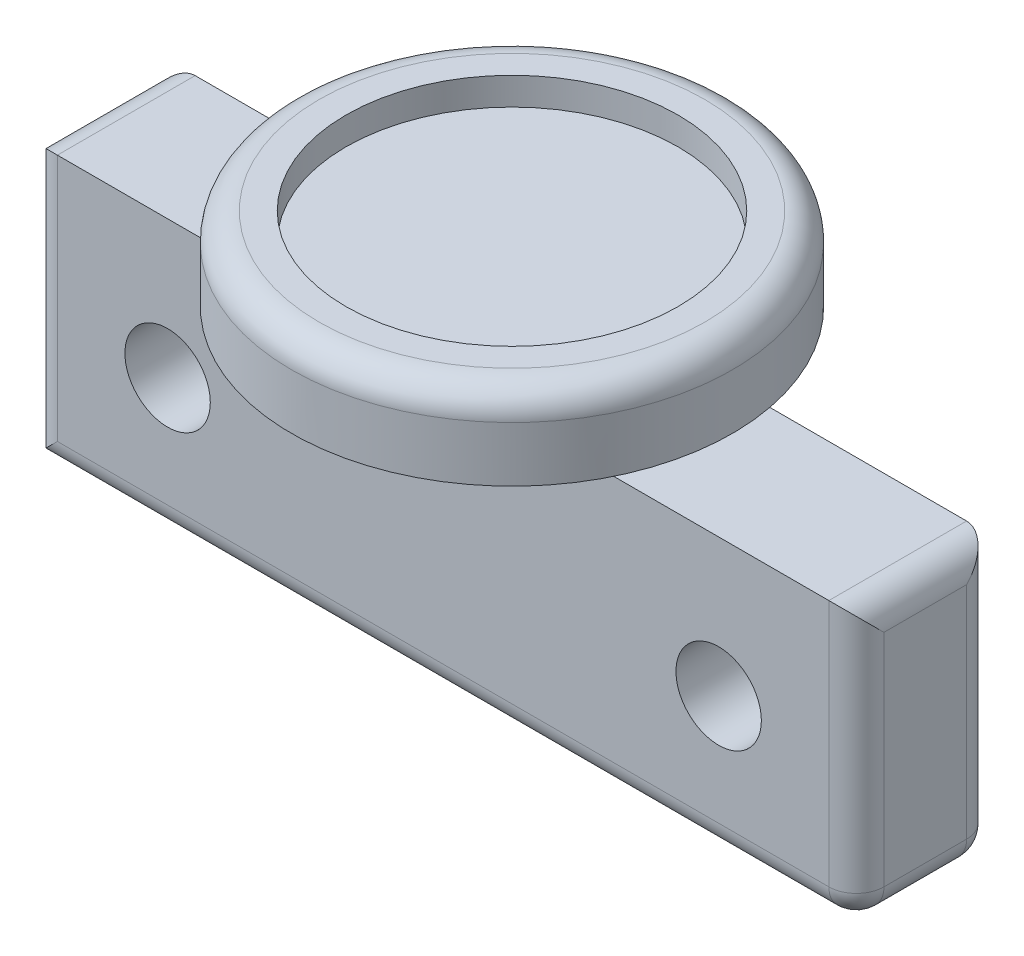
ISO-10303-21;
HEADER;
FILE_DESCRIPTION(('STEP AP214'),'2;1');
FILE_NAME('part.step','',(''),(''),'','','');
FILE_SCHEMA(('AUTOMOTIVE_DESIGN { 1 0 10303 214 1 1 1 1 }'));
ENDSEC;
DATA;
#1=APPLICATION_CONTEXT('core data for automotive mechanical design processes');
#2=APPLICATION_PROTOCOL_DEFINITION('international standard','automotive_design',2000,#1);
#3=PRODUCT_CONTEXT('',#1,'mechanical');
#4=PRODUCT('Part','Part','',(#3));
#5=PRODUCT_RELATED_PRODUCT_CATEGORY('part','',(#4));
#6=PRODUCT_DEFINITION_FORMATION('','',#4);
#7=PRODUCT_DEFINITION_CONTEXT('part definition',#1,'design');
#8=PRODUCT_DEFINITION('design','',#6,#7);
#9=PRODUCT_DEFINITION_SHAPE('','',#8);
#10=(LENGTH_UNIT() NAMED_UNIT(*) SI_UNIT(.MILLI.,.METRE.));
#11=(NAMED_UNIT(*) PLANE_ANGLE_UNIT() SI_UNIT($,.RADIAN.));
#12=(NAMED_UNIT(*) SI_UNIT($,.STERADIAN.) SOLID_ANGLE_UNIT());
#13=UNCERTAINTY_MEASURE_WITH_UNIT(LENGTH_MEASURE(1.E-05),#10,'distance_accuracy_value','');
#14=(GEOMETRIC_REPRESENTATION_CONTEXT(3) GLOBAL_UNCERTAINTY_ASSIGNED_CONTEXT((#13)) GLOBAL_UNIT_ASSIGNED_CONTEXT((#10,
#11,#12)) REPRESENTATION_CONTEXT('',''));
#15=CARTESIAN_POINT('',(0.,0.,0.));
#16=DIRECTION('',(0.,0.,1.));
#17=DIRECTION('',(1.,0.,0.));
#18=AXIS2_PLACEMENT_3D('',#15,#16,#17);
#19=CARTESIAN_POINT('',(-38.1,12.7,6.35));
#20=DIRECTION('',(0.,-1.,0.));
#21=DIRECTION('',(0.,0.,-1.));
#22=AXIS2_PLACEMENT_3D('',#19,#20,#21);
#23=PLANE('',#22);
#24=DIRECTION('',(-1.,0.,0.));
#25=VECTOR('',#24,1.);
#26=CARTESIAN_POINT('',(-38.1,12.7,6.35));
#27=LINE('',#26,#25);
#28=CARTESIAN_POINT('',(35.56,12.7,6.35));
#29=VERTEX_POINT('',#28);
#30=CARTESIAN_POINT('',(10.9985226280624,12.7,6.35));
#31=VERTEX_POINT('',#30);
#32=EDGE_CURVE('E127',#29,#31,#27,.T.);
#33=ORIENTED_EDGE('',*,*,#32,.F.);
#34=DIRECTION('',(0.,0.,-1.));
#35=VECTOR('',#34,1.);
#36=CARTESIAN_POINT('',(35.56,12.7,6.35));
#37=LINE('',#36,#35);
#38=CARTESIAN_POINT('',(35.56,12.7,-6.35));
#39=VERTEX_POINT('',#38);
#40=EDGE_CURVE('E256',#29,#39,#37,.T.);
#41=ORIENTED_EDGE('',*,*,#40,.T.);
#42=DIRECTION('',(-1.,0.,0.));
#43=VECTOR('',#42,1.);
#44=CARTESIAN_POINT('',(-38.1,12.7,-6.35));
#45=LINE('',#44,#43);
#46=CARTESIAN_POINT('',(10.9985226280624,12.7,-6.35));
#47=VERTEX_POINT('',#46);
#48=EDGE_CURVE('E143',#39,#47,#45,.T.);
#49=ORIENTED_EDGE('',*,*,#48,.T.);
#50=CARTESIAN_POINT('',(0.,12.7,0.));
#51=DIRECTION('',(0.,1.,0.));
#52=DIRECTION('',(0.,0.,1.));
#53=AXIS2_PLACEMENT_3D('',#50,#51,#52);
#54=CIRCLE('',#53,12.7);
#55=EDGE_CURVE('E152',#31,#47,#54,.T.);
#56=ORIENTED_EDGE('',*,*,#55,.F.);
#57=EDGE_LOOP('',(#33,#41,#49,#56));
#58=FACE_BOUND('',#57,.T.);
#59=ADVANCED_FACE('F39',(#58),#23,.F.);
#60=CARTESIAN_POINT('',(38.1,12.7,6.35));
#61=DIRECTION('',(-1.,0.,0.));
#62=DIRECTION('',(0.,-1.,0.));
#63=AXIS2_PLACEMENT_3D('',#60,#61,#62);
#64=PLANE('',#63);
#65=DIRECTION('',(0.,1.,0.));
#66=VECTOR('',#65,1.);
#67=CARTESIAN_POINT('',(38.1,-12.7,3.81));
#68=LINE('',#67,#66);
#69=CARTESIAN_POINT('',(38.1,10.16,3.81));
#70=VERTEX_POINT('',#69);
#71=CARTESIAN_POINT('',(38.1,-10.16,3.81));
#72=VERTEX_POINT('',#71);
#73=EDGE_CURVE('E347',#70,#72,#68,.F.);
#74=ORIENTED_EDGE('',*,*,#73,.T.);
#75=DIRECTION('',(0.,0.,-1.));
#76=VECTOR('',#75,1.);
#77=CARTESIAN_POINT('',(38.1,-10.16,6.35));
#78=LINE('',#77,#76);
#79=CARTESIAN_POINT('',(38.1,-10.16,-3.81));
#80=VERTEX_POINT('',#79);
#81=EDGE_CURVE('E358',#72,#80,#78,.T.);
#82=ORIENTED_EDGE('',*,*,#81,.T.);
#83=DIRECTION('',(0.,1.,0.));
#84=VECTOR('',#83,1.);
#85=CARTESIAN_POINT('',(38.1,12.7,-3.81));
#86=LINE('',#85,#84);
#87=CARTESIAN_POINT('',(38.1,10.16,-3.81));
#88=VERTEX_POINT('',#87);
#89=EDGE_CURVE('E355',#80,#88,#86,.T.);
#90=ORIENTED_EDGE('',*,*,#89,.T.);
#91=DIRECTION('',(0.,0.,-1.));
#92=VECTOR('',#91,1.);
#93=CARTESIAN_POINT('',(38.1,10.16,6.35));
#94=LINE('',#93,#92);
#95=EDGE_CURVE('E350',#88,#70,#94,.F.);
#96=ORIENTED_EDGE('',*,*,#95,.T.);
#97=EDGE_LOOP('',(#74,#82,#90,#96));
#98=FACE_BOUND('',#97,.T.);
#99=ADVANCED_FACE('F276',(#98),#64,.F.);
#100=CARTESIAN_POINT('',(-10.9985226280624,12.7,-6.35));
#101=VERTEX_POINT('',#100);
#102=CARTESIAN_POINT('',(-35.56,12.7,-6.35));
#103=VERTEX_POINT('',#102);
#104=EDGE_CURVE('E243',#101,#103,#45,.T.);
#105=ORIENTED_EDGE('',*,*,#104,.T.);
#106=DIRECTION('',(0.,0.,-1.));
#107=VECTOR('',#106,1.);
#108=CARTESIAN_POINT('',(-35.56,12.7,6.35));
#109=LINE('',#108,#107);
#110=CARTESIAN_POINT('',(-35.56,12.7,6.35));
#111=VERTEX_POINT('',#110);
#112=EDGE_CURVE('E141',#103,#111,#109,.F.);
#113=ORIENTED_EDGE('',*,*,#112,.T.);
#114=CARTESIAN_POINT('',(-10.9985226280624,12.7,6.35));
#115=VERTEX_POINT('',#114);
#116=EDGE_CURVE('E124',#115,#111,#27,.T.);
#117=ORIENTED_EDGE('',*,*,#116,.F.);
#118=EDGE_CURVE('E138',#101,#115,#54,.T.);
#119=ORIENTED_EDGE('',*,*,#118,.F.);
#120=EDGE_LOOP('',(#105,#113,#117,#119));
#121=FACE_BOUND('',#120,.T.);
#122=ADVANCED_FACE('F136',(#121),#23,.F.);
#123=CARTESIAN_POINT('',(-38.1,12.7,6.35));
#124=DIRECTION('',(1.,0.,0.));
#125=DIRECTION('',(0.,0.,-1.));
#126=AXIS2_PLACEMENT_3D('',#123,#124,#125);
#127=PLANE('',#126);
#128=DIRECTION('',(0.,0.,-1.));
#129=VECTOR('',#128,1.);
#130=CARTESIAN_POINT('',(-38.1,10.16,6.35));
#131=LINE('',#130,#129);
#132=CARTESIAN_POINT('',(-38.1,10.16,3.81));
#133=VERTEX_POINT('',#132);
#134=CARTESIAN_POINT('',(-38.1,10.16,-3.81));
#135=VERTEX_POINT('',#134);
#136=EDGE_CURVE('E387',#133,#135,#131,.T.);
#137=ORIENTED_EDGE('',*,*,#136,.T.);
#138=DIRECTION('',(0.,-1.,0.));
#139=VECTOR('',#138,1.);
#140=CARTESIAN_POINT('',(-38.1,12.7,-3.81));
#141=LINE('',#140,#139);
#142=CARTESIAN_POINT('',(-38.1,-12.7,-3.81));
#143=VERTEX_POINT('',#142);
#144=EDGE_CURVE('E390',#135,#143,#141,.T.);
#145=ORIENTED_EDGE('',*,*,#144,.T.);
#146=DIRECTION('',(0.,0.,-1.));
#147=VECTOR('',#146,1.);
#148=CARTESIAN_POINT('',(-38.1,-12.7,6.35));
#149=LINE('',#148,#147);
#150=CARTESIAN_POINT('',(-38.1,-12.7,3.81));
#151=VERTEX_POINT('',#150);
#152=EDGE_CURVE('E158',#151,#143,#149,.T.);
#153=ORIENTED_EDGE('',*,*,#152,.F.);
#154=DIRECTION('',(0.,-1.,0.));
#155=VECTOR('',#154,1.);
#156=CARTESIAN_POINT('',(-38.1,12.7,3.81));
#157=LINE('',#156,#155);
#158=EDGE_CURVE('E384',#151,#133,#157,.F.);
#159=ORIENTED_EDGE('',*,*,#158,.T.);
#160=EDGE_LOOP('',(#137,#145,#153,#159));
#161=FACE_BOUND('',#160,.T.);
#162=ADVANCED_FACE('F285',(#161),#127,.F.);
#163=CARTESIAN_POINT('',(-38.1,-12.7,6.35));
#164=DIRECTION('',(0.,1.,0.));
#165=DIRECTION('',(0.,0.,1.));
#166=AXIS2_PLACEMENT_3D('',#163,#164,#165);
#167=PLANE('',#166);
#168=ORIENTED_EDGE('',*,*,#152,.T.);
#169=DIRECTION('',(1.,0.,0.));
#170=VECTOR('',#169,1.);
#171=CARTESIAN_POINT('',(-38.1,-12.7,-3.81));
#172=LINE('',#171,#170);
#173=CARTESIAN_POINT('',(35.56,-12.7,-3.81));
#174=VERTEX_POINT('',#173);
#175=EDGE_CURVE('E369',#143,#174,#172,.T.);
#176=ORIENTED_EDGE('',*,*,#175,.T.);
#177=DIRECTION('',(0.,0.,-1.));
#178=VECTOR('',#177,1.);
#179=CARTESIAN_POINT('',(35.56,-12.7,6.35));
#180=LINE('',#179,#178);
#181=CARTESIAN_POINT('',(35.56,-12.7,3.81));
#182=VERTEX_POINT('',#181);
#183=EDGE_CURVE('E365',#174,#182,#180,.F.);
#184=ORIENTED_EDGE('',*,*,#183,.T.);
#185=DIRECTION('',(1.,0.,0.));
#186=VECTOR('',#185,1.);
#187=CARTESIAN_POINT('',(-38.1,-12.7,3.81));
#188=LINE('',#187,#186);
#189=EDGE_CURVE('E362',#182,#151,#188,.F.);
#190=ORIENTED_EDGE('',*,*,#189,.T.);
#191=EDGE_LOOP('',(#168,#176,#184,#190));
#192=FACE_BOUND('',#191,.T.);
#193=ADVANCED_FACE('F289',(#192),#167,.F.);
#194=CARTESIAN_POINT('',(0.,0.,6.35));
#195=DIRECTION('',(0.,0.,1.));
#196=DIRECTION('',(1.,0.,0.));
#197=AXIS2_PLACEMENT_3D('',#194,#195,#196);
#198=PLANE('',#197);
#199=CARTESIAN_POINT('',(25.4,0.,6.35));
#200=DIRECTION('',(0.,0.,1.));
#201=DIRECTION('',(1.,0.,0.));
#202=AXIS2_PLACEMENT_3D('',#199,#200,#201);
#203=CIRCLE('',#202,3.937);
#204=CARTESIAN_POINT('',(29.337,0.,6.35));
#205=VERTEX_POINT('',#204);
#206=EDGE_CURVE('E237',#205,#205,#203,.T.);
#207=ORIENTED_EDGE('',*,*,#206,.F.);
#208=EDGE_LOOP('',(#207));
#209=FACE_BOUND('',#208,.T.);
#210=CARTESIAN_POINT('',(-25.4,0.,6.35));
#211=DIRECTION('',(0.,0.,1.));
#212=DIRECTION('',(1.,0.,0.));
#213=AXIS2_PLACEMENT_3D('',#210,#211,#212);
#214=CIRCLE('',#213,3.937);
#215=CARTESIAN_POINT('',(-21.463,0.,6.35));
#216=VERTEX_POINT('',#215);
#217=EDGE_CURVE('E231',#216,#216,#214,.T.);
#218=ORIENTED_EDGE('',*,*,#217,.F.);
#219=EDGE_LOOP('',(#218));
#220=FACE_BOUND('',#219,.T.);
#221=ORIENTED_EDGE('',*,*,#116,.T.);
#222=DIRECTION('',(0.,-1.,0.));
#223=VECTOR('',#222,1.);
#224=CARTESIAN_POINT('',(-35.56,-12.7,6.35));
#225=LINE('',#224,#223);
#226=CARTESIAN_POINT('',(-35.56,-10.16,6.35));
#227=VERTEX_POINT('',#226);
#228=EDGE_CURVE('E11',#111,#227,#225,.T.);
#229=ORIENTED_EDGE('',*,*,#228,.T.);
#230=DIRECTION('',(1.,0.,0.));
#231=VECTOR('',#230,1.);
#232=CARTESIAN_POINT('',(38.1,-10.16,6.35));
#233=LINE('',#232,#231);
#234=CARTESIAN_POINT('',(35.56,-10.16,6.35));
#235=VERTEX_POINT('',#234);
#236=EDGE_CURVE('E56',#227,#235,#233,.T.);
#237=ORIENTED_EDGE('',*,*,#236,.T.);
#238=DIRECTION('',(0.,1.,0.));
#239=VECTOR('',#238,1.);
#240=CARTESIAN_POINT('',(35.56,12.7,6.35));
#241=LINE('',#240,#239);
#242=EDGE_CURVE('E49',#235,#29,#241,.T.);
#243=ORIENTED_EDGE('',*,*,#242,.T.);
#244=ORIENTED_EDGE('',*,*,#32,.T.);
#245=EDGE_CURVE('E121',#31,#115,#27,.T.);
#246=ORIENTED_EDGE('',*,*,#245,.T.);
#247=EDGE_LOOP('',(#221,#229,#237,#243,#244,#246));
#248=FACE_BOUND('',#247,.T.);
#249=ADVANCED_FACE('F123',(#209,#220,#248),#198,.T.);
#250=CARTESIAN_POINT('',(0.,0.,-6.35));
#251=DIRECTION('',(0.,0.,1.));
#252=DIRECTION('',(1.,0.,0.));
#253=AXIS2_PLACEMENT_3D('',#250,#251,#252);
#254=PLANE('',#253);
#255=CARTESIAN_POINT('',(25.4,0.,-6.35));
#256=DIRECTION('',(0.,0.,1.));
#257=DIRECTION('',(1.,0.,0.));
#258=AXIS2_PLACEMENT_3D('',#255,#256,#257);
#259=CIRCLE('',#258,3.93699999999999);
#260=CARTESIAN_POINT('',(29.337,0.,-6.35));
#261=VERTEX_POINT('',#260);
#262=EDGE_CURVE('E43',#261,#261,#259,.T.);
#263=ORIENTED_EDGE('',*,*,#262,.T.);
#264=EDGE_LOOP('',(#263));
#265=FACE_BOUND('',#264,.T.);
#266=CARTESIAN_POINT('',(-25.4,0.,-6.35));
#267=DIRECTION('',(0.,0.,1.));
#268=DIRECTION('',(1.,0.,0.));
#269=AXIS2_PLACEMENT_3D('',#266,#267,#268);
#270=CIRCLE('',#269,3.93699999999999);
#271=CARTESIAN_POINT('',(-21.463,0.,-6.35));
#272=VERTEX_POINT('',#271);
#273=EDGE_CURVE('E227',#272,#272,#270,.T.);
#274=ORIENTED_EDGE('',*,*,#273,.T.);
#275=EDGE_LOOP('',(#274));
#276=FACE_BOUND('',#275,.T.);
#277=ORIENTED_EDGE('',*,*,#48,.F.);
#278=DIRECTION('',(0.,1.,0.));
#279=VECTOR('',#278,1.);
#280=CARTESIAN_POINT('',(35.56,0.,-6.35));
#281=LINE('',#280,#279);
#282=CARTESIAN_POINT('',(35.56,-10.16,-6.35));
#283=VERTEX_POINT('',#282);
#284=EDGE_CURVE('E379',#39,#283,#281,.F.);
#285=ORIENTED_EDGE('',*,*,#284,.T.);
#286=DIRECTION('',(1.,0.,0.));
#287=VECTOR('',#286,1.);
#288=CARTESIAN_POINT('',(0.,-10.16,-6.35));
#289=LINE('',#288,#287);
#290=CARTESIAN_POINT('',(-35.56,-10.16,-6.35));
#291=VERTEX_POINT('',#290);
#292=EDGE_CURVE('E375',#283,#291,#289,.F.);
#293=ORIENTED_EDGE('',*,*,#292,.T.);
#294=DIRECTION('',(0.,-1.,0.));
#295=VECTOR('',#294,1.);
#296=CARTESIAN_POINT('',(-35.56,0.,-6.35));
#297=LINE('',#296,#295);
#298=EDGE_CURVE('E372',#291,#103,#297,.F.);
#299=ORIENTED_EDGE('',*,*,#298,.T.);
#300=ORIENTED_EDGE('',*,*,#104,.F.);
#301=EDGE_CURVE('E247',#47,#101,#45,.T.);
#302=ORIENTED_EDGE('',*,*,#301,.F.);
#303=EDGE_LOOP('',(#277,#285,#293,#299,#300,#302));
#304=FACE_BOUND('',#303,.T.);
#305=ADVANCED_FACE('F259',(#265,#276,#304),#254,.F.);
#306=CARTESIAN_POINT('',(0.,12.7,0.));
#307=DIRECTION('',(0.,1.,0.));
#308=DIRECTION('',(0.,0.,1.));
#309=AXIS2_PLACEMENT_3D('',#306,#307,#308);
#310=PLANE('',#309);
#311=EDGE_CURVE('E149',#47,#101,#54,.T.);
#312=ORIENTED_EDGE('',*,*,#311,.F.);
#313=ORIENTED_EDGE('',*,*,#301,.T.);
#314=EDGE_LOOP('',(#312,#313));
#315=FACE_BOUND('',#314,.T.);
#316=ADVANCED_FACE('F261',(#315),#310,.F.);
#317=CARTESIAN_POINT('',(0.,15.24,0.));
#318=DIRECTION('',(0.,-1.,0.));
#319=DIRECTION('',(0.,0.,-1.));
#320=AXIS2_PLACEMENT_3D('',#317,#318,#319);
#321=CYLINDRICAL_SURFACE('',#320,12.7);
#322=CARTESIAN_POINT('',(0.,15.24,0.));
#323=DIRECTION('',(0.,1.,0.));
#324=DIRECTION('',(0.,0.,1.));
#325=AXIS2_PLACEMENT_3D('',#322,#323,#324);
#326=CIRCLE('',#325,12.7);
#327=CARTESIAN_POINT('',(0.,15.24,12.7));
#328=VERTEX_POINT('',#327);
#329=EDGE_CURVE('E168',#328,#328,#326,.T.);
#330=ORIENTED_EDGE('',*,*,#329,.F.);
#331=EDGE_LOOP('',(#330));
#332=FACE_BOUND('',#331,.T.);
#333=ORIENTED_EDGE('',*,*,#55,.T.);
#334=ORIENTED_EDGE('',*,*,#311,.T.);
#335=ORIENTED_EDGE('',*,*,#118,.T.);
#336=EDGE_CURVE('E144',#115,#31,#54,.T.);
#337=ORIENTED_EDGE('',*,*,#336,.T.);
#338=EDGE_LOOP('',(#333,#334,#335,#337));
#339=FACE_BOUND('',#338,.T.);
#340=ADVANCED_FACE('F154',(#332,#339),#321,.T.);
#341=ORIENTED_EDGE('',*,*,#245,.F.);
#342=ORIENTED_EDGE('',*,*,#336,.F.);
#343=EDGE_LOOP('',(#341,#342));
#344=FACE_BOUND('',#343,.T.);
#345=ADVANCED_FACE('F145',(#344),#310,.F.);
#346=CARTESIAN_POINT('',(0.,22.86,0.));
#347=DIRECTION('',(0.,-1.,0.));
#348=DIRECTION('',(0.,0.,-1.));
#349=AXIS2_PLACEMENT_3D('',#346,#347,#348);
#350=CYLINDRICAL_SURFACE('',#349,20.32);
#351=CARTESIAN_POINT('',(0.,20.32,0.));
#352=DIRECTION('',(0.,1.,0.));
#353=DIRECTION('',(0.,0.,1.));
#354=AXIS2_PLACEMENT_3D('',#351,#352,#353);
#355=CIRCLE('',#354,20.32);
#356=CARTESIAN_POINT('',(0.,20.32,-20.32));
#357=VERTEX_POINT('',#356);
#358=EDGE_CURVE('E162',#357,#357,#355,.F.);
#359=CARTESIAN_POINT('',(0.,15.24,0.));
#360=DIRECTION('',(0.,1.,0.));
#361=DIRECTION('',(0.,0.,1.));
#362=AXIS2_PLACEMENT_3D('',#359,#360,#361);
#363=CIRCLE('',#362,20.32);
#364=CARTESIAN_POINT('',(0.,15.24,-20.32));
#365=VERTEX_POINT('',#364);
#366=EDGE_CURVE('E150',#365,#365,#363,.T.);
#367=CARTESIAN_POINT('',(0.,20.32,-20.32));
#368=CARTESIAN_POINT('',(0.,20.2670833333333,-20.32));
#369=CARTESIAN_POINT('',(0.,20.2141666666667,-20.32));
#370=CARTESIAN_POINT('',(0.,20.1083333333333,-20.32));
#371=CARTESIAN_POINT('',(0.,20.0554166666667,-20.32));
#372=CARTESIAN_POINT('',(0.,19.9495833333333,-20.32));
#373=CARTESIAN_POINT('',(0.,19.8966666666667,-20.32));
#374=CARTESIAN_POINT('',(0.,19.7908333333333,-20.32));
#375=CARTESIAN_POINT('',(0.,19.7379166666667,-20.32));
#376=CARTESIAN_POINT('',(0.,19.6320833333333,-20.32));
#377=CARTESIAN_POINT('',(0.,19.5791666666667,-20.32));
#378=CARTESIAN_POINT('',(0.,19.4733333333333,-20.32));
#379=CARTESIAN_POINT('',(0.,19.4204166666667,-20.32));
#380=CARTESIAN_POINT('',(0.,19.3145833333333,-20.32));
#381=CARTESIAN_POINT('',(0.,19.2616666666667,-20.32));
#382=CARTESIAN_POINT('',(0.,19.1558333333333,-20.32));
#383=CARTESIAN_POINT('',(0.,19.1029166666667,-20.32));
#384=CARTESIAN_POINT('',(0.,18.9970833333333,-20.32));
#385=CARTESIAN_POINT('',(0.,18.9441666666667,-20.32));
#386=CARTESIAN_POINT('',(0.,18.8383333333333,-20.32));
#387=CARTESIAN_POINT('',(0.,18.7854166666667,-20.32));
#388=CARTESIAN_POINT('',(0.,18.6795833333333,-20.32));
#389=CARTESIAN_POINT('',(0.,18.6266666666667,-20.32));
#390=CARTESIAN_POINT('',(0.,18.5208333333333,-20.32));
#391=CARTESIAN_POINT('',(0.,18.4679166666667,-20.32));
#392=CARTESIAN_POINT('',(0.,18.3620833333333,-20.32));
#393=CARTESIAN_POINT('',(0.,18.3091666666667,-20.32));
#394=CARTESIAN_POINT('',(0.,18.2033333333333,-20.32));
#395=CARTESIAN_POINT('',(0.,18.1504166666667,-20.32));
#396=CARTESIAN_POINT('',(0.,18.0445833333333,-20.32));
#397=CARTESIAN_POINT('',(0.,17.9916666666667,-20.32));
#398=CARTESIAN_POINT('',(0.,17.8858333333333,-20.32));
#399=CARTESIAN_POINT('',(0.,17.8329166666667,-20.32));
#400=CARTESIAN_POINT('',(0.,17.7270833333333,-20.32));
#401=CARTESIAN_POINT('',(0.,17.6741666666667,-20.32));
#402=CARTESIAN_POINT('',(0.,17.5683333333333,-20.32));
#403=CARTESIAN_POINT('',(0.,17.5154166666667,-20.32));
#404=CARTESIAN_POINT('',(0.,17.4095833333333,-20.32));
#405=CARTESIAN_POINT('',(0.,17.3566666666667,-20.32));
#406=CARTESIAN_POINT('',(0.,17.2508333333333,-20.32));
#407=CARTESIAN_POINT('',(0.,17.1979166666667,-20.32));
#408=CARTESIAN_POINT('',(0.,17.0920833333333,-20.32));
#409=CARTESIAN_POINT('',(0.,17.0391666666667,-20.32));
#410=CARTESIAN_POINT('',(0.,16.9333333333333,-20.32));
#411=CARTESIAN_POINT('',(0.,16.8804166666667,-20.32));
#412=CARTESIAN_POINT('',(0.,16.7745833333333,-20.32));
#413=CARTESIAN_POINT('',(0.,16.7216666666667,-20.32));
#414=CARTESIAN_POINT('',(0.,16.6158333333333,-20.32));
#415=CARTESIAN_POINT('',(0.,16.5629166666667,-20.32));
#416=CARTESIAN_POINT('',(0.,16.4570833333333,-20.32));
#417=CARTESIAN_POINT('',(0.,16.4041666666667,-20.32));
#418=CARTESIAN_POINT('',(0.,16.2983333333333,-20.32));
#419=CARTESIAN_POINT('',(0.,16.2454166666667,-20.32));
#420=CARTESIAN_POINT('',(0.,16.1395833333333,-20.32));
#421=CARTESIAN_POINT('',(0.,16.0866666666667,-20.32));
#422=CARTESIAN_POINT('',(0.,15.9808333333333,-20.32));
#423=CARTESIAN_POINT('',(0.,15.9279166666667,-20.32));
#424=CARTESIAN_POINT('',(0.,15.8220833333333,-20.32));
#425=CARTESIAN_POINT('',(0.,15.7691666666667,-20.32));
#426=CARTESIAN_POINT('',(0.,15.6633333333333,-20.32));
#427=CARTESIAN_POINT('',(0.,15.6104166666667,-20.32));
#428=CARTESIAN_POINT('',(0.,15.5045833333333,-20.32));
#429=CARTESIAN_POINT('',(0.,15.4516666666667,-20.32));
#430=CARTESIAN_POINT('',(0.,15.3458333333333,-20.32));
#431=CARTESIAN_POINT('',(0.,15.2929166666667,-20.32));
#432=CARTESIAN_POINT('',(0.,15.24,-20.32));
#433=B_SPLINE_CURVE_WITH_KNOTS('',3,(#367,#368,#369,#370,#371,#372,#373,#374,#375,#376,#377,
#378,#379,#380,#381,#382,#383,#384,#385,#386,#387,#388,#389,#390,#391,#392,#393,#394,#395,#396,
#397,#398,#399,#400,#401,#402,#403,#404,#405,#406,#407,#408,#409,#410,#411,#412,#413,#414,#415,
#416,#417,#418,#419,#420,#421,#422,#423,#424,#425,#426,#427,#428,#429,#430,#431,#432),
.UNSPECIFIED.,.F.,.F.,(4,2,2,2,2,2,2,2,2,2,2,2,2,2,2,2,2,2,2,2,2,2,2,2,2,2,2,2,2,2,2,2,4),(0.,
0.158750000000003,0.317500000000002,0.476250000000001,0.635,0.793750000000003,0.952500000000002,
1.11125,1.27,1.42875,1.5875,1.74625,1.905,2.06375,2.2225,2.38125,2.54,2.69875,2.8575,3.01625,
3.175,3.33375,3.4925,3.65125,3.81,3.96875,4.1275,4.28625,4.445,4.60375,4.7625,4.92125,5.08),.UNSPECIFIED.);
#434=EDGE_CURVE('BSEAM274',#357,#365,#433,.T.);
#435=ORIENTED_EDGE('',*,*,#358,.T.);
#436=ORIENTED_EDGE('',*,*,#366,.T.);
#437=ORIENTED_EDGE('',*,*,#434,.T.);
#438=ORIENTED_EDGE('',*,*,#434,.F.);
#439=EDGE_LOOP('',(#435,#437,#436,#438));
#440=FACE_BOUND('',#439,.T.);
#441=ADVANCED_FACE('F274',(#440),#350,.T.);
#442=CARTESIAN_POINT('',(0.,22.86,0.));
#443=DIRECTION('',(0.,1.,0.));
#444=DIRECTION('',(0.,0.,1.));
#445=AXIS2_PLACEMENT_3D('',#442,#443,#444);
#446=PLANE('',#445);
#447=CARTESIAN_POINT('',(0.,22.86,0.));
#448=DIRECTION('',(0.,1.,0.));
#449=DIRECTION('',(0.,0.,1.));
#450=AXIS2_PLACEMENT_3D('',#447,#448,#449);
#451=CIRCLE('',#450,17.78);
#452=CARTESIAN_POINT('',(0.,22.86,17.78));
#453=VERTEX_POINT('',#452);
#454=EDGE_CURVE('E157',#453,#453,#451,.T.);
#455=ORIENTED_EDGE('',*,*,#454,.T.);
#456=EDGE_LOOP('',(#455));
#457=FACE_BOUND('',#456,.T.);
#458=CARTESIAN_POINT('',(0.,22.86,0.));
#459=DIRECTION('',(0.,1.,0.));
#460=DIRECTION('',(0.,0.,1.));
#461=AXIS2_PLACEMENT_3D('',#458,#459,#460);
#462=CIRCLE('',#461,15.3050537283875);
#463=CARTESIAN_POINT('',(0.,22.86,15.3050537283875));
#464=VERTEX_POINT('',#463);
#465=EDGE_CURVE('E178',#464,#464,#462,.T.);
#466=ORIENTED_EDGE('',*,*,#465,.F.);
#467=EDGE_LOOP('',(#466));
#468=FACE_BOUND('',#467,.T.);
#469=ADVANCED_FACE('F331',(#457,#468),#446,.T.);
#470=CARTESIAN_POINT('',(0.,15.24,0.));
#471=DIRECTION('',(0.,1.,0.));
#472=DIRECTION('',(0.,0.,1.));
#473=AXIS2_PLACEMENT_3D('',#470,#471,#472);
#474=PLANE('',#473);
#475=ORIENTED_EDGE('',*,*,#329,.T.);
#476=EDGE_LOOP('',(#475));
#477=FACE_BOUND('',#476,.T.);
#478=ORIENTED_EDGE('',*,*,#366,.F.);
#479=EDGE_LOOP('',(#478));
#480=FACE_BOUND('',#479,.T.);
#481=ADVANCED_FACE('F329',(#477,#480),#474,.F.);
#482=CARTESIAN_POINT('',(0.,20.32,0.));
#483=DIRECTION('',(0.,1.,0.));
#484=DIRECTION('',(0.,0.,1.));
#485=AXIS2_PLACEMENT_3D('',#482,#483,#484);
#486=CYLINDRICAL_SURFACE('',#485,15.3050537283875);
#487=CARTESIAN_POINT('',(0.,20.32,0.));
#488=DIRECTION('',(0.,1.,0.));
#489=DIRECTION('',(0.,0.,1.));
#490=AXIS2_PLACEMENT_3D('',#487,#488,#489);
#491=CIRCLE('',#490,15.3050537283875);
#492=CARTESIAN_POINT('',(0.,20.32,15.3050537283875));
#493=VERTEX_POINT('',#492);
#494=EDGE_CURVE('E174',#493,#493,#491,.T.);
#495=ORIENTED_EDGE('',*,*,#494,.F.);
#496=EDGE_LOOP('',(#495));
#497=FACE_BOUND('',#496,.T.);
#498=ORIENTED_EDGE('',*,*,#465,.T.);
#499=EDGE_LOOP('',(#498));
#500=FACE_BOUND('',#499,.T.);
#501=ADVANCED_FACE('F325',(#497,#500),#486,.F.);
#502=CARTESIAN_POINT('',(0.,20.32,0.));
#503=DIRECTION('',(0.,1.,0.));
#504=DIRECTION('',(0.,0.,1.));
#505=AXIS2_PLACEMENT_3D('',#502,#503,#504);
#506=PLANE('',#505);
#507=ORIENTED_EDGE('',*,*,#494,.T.);
#508=EDGE_LOOP('',(#507));
#509=FACE_BOUND('',#508,.T.);
#510=ADVANCED_FACE('F321',(#509),#506,.T.);
#511=CARTESIAN_POINT('',(0.,20.32,0.));
#512=DIRECTION('',(0.,1.,0.));
#513=DIRECTION('',(0.,0.,1.));
#514=AXIS2_PLACEMENT_3D('',#511,#512,#513);
#515=TOROIDAL_SURFACE('',#514,17.78,2.54);
#516=ORIENTED_EDGE('',*,*,#358,.F.);
#517=EDGE_LOOP('',(#516));
#518=FACE_BOUND('',#517,.T.);
#519=ORIENTED_EDGE('',*,*,#454,.F.);
#520=EDGE_LOOP('',(#519));
#521=FACE_BOUND('',#520,.T.);
#522=ADVANCED_FACE('F324',(#518,#521),#515,.T.);
#523=CARTESIAN_POINT('',(-35.56,10.16,6.35));
#524=DIRECTION('',(0.,0.,-1.));
#525=DIRECTION('',(-1.,0.,0.));
#526=AXIS2_PLACEMENT_3D('',#523,#524,#525);
#527=CYLINDRICAL_SURFACE('',#526,2.54);
#528=CARTESIAN_POINT('',(-35.56,10.16,-3.81));
#529=DIRECTION('',(0.,-0.707106781186547,-0.707106781186547));
#530=DIRECTION('',(0.,-0.707106781186547,0.707106781186547));
#531=AXIS2_PLACEMENT_3D('',#528,#529,#530);
#532=ELLIPSE('',#531,3.59210244842766,2.54);
#533=EDGE_CURVE('E186',#135,#103,#532,.T.);
#534=ORIENTED_EDGE('',*,*,#533,.F.);
#535=ORIENTED_EDGE('',*,*,#136,.F.);
#536=CARTESIAN_POINT('',(-35.56,10.16,3.81));
#537=DIRECTION('',(0.,0.707106781186547,-0.707106781186547));
#538=DIRECTION('',(0.,0.707106781186547,0.707106781186547));
#539=AXIS2_PLACEMENT_3D('',#536,#537,#538);
#540=ELLIPSE('',#539,3.59210244842766,2.54);
#541=EDGE_CURVE('E182',#111,#133,#540,.F.);
#542=ORIENTED_EDGE('',*,*,#541,.F.);
#543=ORIENTED_EDGE('',*,*,#112,.F.);
#544=EDGE_LOOP('',(#534,#535,#542,#543));
#545=FACE_BOUND('',#544,.T.);
#546=ADVANCED_FACE('F41',(#545),#527,.T.);
#547=CARTESIAN_POINT('',(-35.56,0.,3.81));
#548=DIRECTION('',(0.,1.,0.));
#549=DIRECTION('',(0.,0.,1.));
#550=AXIS2_PLACEMENT_3D('',#547,#548,#549);
#551=CYLINDRICAL_SURFACE('',#550,2.54);
#552=ORIENTED_EDGE('',*,*,#541,.T.);
#553=ORIENTED_EDGE('',*,*,#158,.F.);
#554=CARTESIAN_POINT('',(-35.56,-10.16,3.81));
#555=DIRECTION('',(-0.707106781186547,0.707106781186547,0.));
#556=DIRECTION('',(-0.707106781186547,-0.707106781186547,0.));
#557=AXIS2_PLACEMENT_3D('',#554,#555,#556);
#558=ELLIPSE('',#557,3.59210244842766,2.54);
#559=EDGE_CURVE('E190',#227,#151,#558,.F.);
#560=ORIENTED_EDGE('',*,*,#559,.F.);
#561=ORIENTED_EDGE('',*,*,#228,.F.);
#562=EDGE_LOOP('',(#552,#553,#560,#561));
#563=FACE_BOUND('',#562,.T.);
#564=ADVANCED_FACE('F431',(#563),#551,.T.);
#565=CARTESIAN_POINT('',(35.56,10.16,6.35));
#566=DIRECTION('',(0.,0.,-1.));
#567=DIRECTION('',(-1.,0.,0.));
#568=AXIS2_PLACEMENT_3D('',#565,#566,#567);
#569=CYLINDRICAL_SURFACE('',#568,2.54);
#570=CARTESIAN_POINT('',(35.56,10.16,-3.81));
#571=DIRECTION('',(0.,-0.707106781186547,-0.707106781186547));
#572=DIRECTION('',(0.,0.707106781186547,-0.707106781186547));
#573=AXIS2_PLACEMENT_3D('',#570,#571,#572);
#574=ELLIPSE('',#573,3.59210244842766,2.54);
#575=EDGE_CURVE('E198',#39,#88,#574,.T.);
#576=ORIENTED_EDGE('',*,*,#575,.F.);
#577=ORIENTED_EDGE('',*,*,#40,.F.);
#578=CARTESIAN_POINT('',(35.56,10.16,3.81));
#579=DIRECTION('',(0.,-0.707106781186547,0.707106781186547));
#580=DIRECTION('',(0.,-0.707106781186547,-0.707106781186547));
#581=AXIS2_PLACEMENT_3D('',#578,#579,#580);
#582=ELLIPSE('',#581,3.59210244842766,2.54);
#583=EDGE_CURVE('E194',#70,#29,#582,.T.);
#584=ORIENTED_EDGE('',*,*,#583,.F.);
#585=ORIENTED_EDGE('',*,*,#95,.F.);
#586=EDGE_LOOP('',(#576,#577,#584,#585));
#587=FACE_BOUND('',#586,.T.);
#588=ADVANCED_FACE('F404',(#587),#569,.T.);
#589=CARTESIAN_POINT('',(-35.56,12.7,-3.81));
#590=DIRECTION('',(0.,-1.,0.));
#591=DIRECTION('',(0.,0.,-1.));
#592=AXIS2_PLACEMENT_3D('',#589,#590,#591);
#593=CYLINDRICAL_SURFACE('',#592,2.54);
#594=ORIENTED_EDGE('',*,*,#533,.T.);
#595=ORIENTED_EDGE('',*,*,#298,.F.);
#596=CARTESIAN_POINT('',(-35.56,-10.16,-3.81));
#597=DIRECTION('',(0.707106781186547,-0.707106781186547,0.));
#598=DIRECTION('',(-0.707106781186547,-0.707106781186547,0.));
#599=AXIS2_PLACEMENT_3D('',#596,#597,#598);
#600=ELLIPSE('',#599,3.59210244842766,2.54);
#601=EDGE_CURVE('E202',#143,#291,#600,.T.);
#602=ORIENTED_EDGE('',*,*,#601,.F.);
#603=ORIENTED_EDGE('',*,*,#144,.F.);
#604=EDGE_LOOP('',(#594,#595,#602,#603));
#605=FACE_BOUND('',#604,.T.);
#606=ADVANCED_FACE('F425',(#605),#593,.T.);
#607=CARTESIAN_POINT('',(0.,-10.16,3.81));
#608=DIRECTION('',(-1.,0.,0.));
#609=DIRECTION('',(0.,0.,1.));
#610=AXIS2_PLACEMENT_3D('',#607,#608,#609);
#611=CYLINDRICAL_SURFACE('',#610,2.54);
#612=ORIENTED_EDGE('',*,*,#559,.T.);
#613=ORIENTED_EDGE('',*,*,#189,.F.);
#614=CARTESIAN_POINT('',(35.56,-10.16,3.81));
#615=DIRECTION('',(1.,0.,0.));
#616=DIRECTION('',(0.,0.,-1.));
#617=AXIS2_PLACEMENT_3D('',#614,#615,#616);
#618=CIRCLE('',#617,2.54);
#619=EDGE_CURVE('E205',#235,#182,#618,.T.);
#620=ORIENTED_EDGE('',*,*,#619,.F.);
#621=ORIENTED_EDGE('',*,*,#236,.F.);
#622=EDGE_LOOP('',(#612,#613,#620,#621));
#623=FACE_BOUND('',#622,.T.);
#624=ADVANCED_FACE('F434',(#623),#611,.T.);
#625=CARTESIAN_POINT('',(35.56,0.,3.81));
#626=DIRECTION('',(0.,-1.,0.));
#627=DIRECTION('',(1.,0.,0.));
#628=AXIS2_PLACEMENT_3D('',#625,#626,#627);
#629=CYLINDRICAL_SURFACE('',#628,2.54);
#630=ORIENTED_EDGE('',*,*,#583,.T.);
#631=ORIENTED_EDGE('',*,*,#242,.F.);
#632=CARTESIAN_POINT('',(35.56,-10.16,3.81));
#633=DIRECTION('',(0.,-1.,0.));
#634=DIRECTION('',(0.,0.,-1.));
#635=AXIS2_PLACEMENT_3D('',#632,#633,#634);
#636=CIRCLE('',#635,2.54);
#637=EDGE_CURVE('E209',#72,#235,#636,.T.);
#638=ORIENTED_EDGE('',*,*,#637,.F.);
#639=ORIENTED_EDGE('',*,*,#73,.F.);
#640=EDGE_LOOP('',(#630,#631,#638,#639));
#641=FACE_BOUND('',#640,.T.);
#642=ADVANCED_FACE('F408',(#641),#629,.T.);
#643=CARTESIAN_POINT('',(35.56,12.7,-3.81));
#644=DIRECTION('',(0.,1.,0.));
#645=DIRECTION('',(-1.,0.,0.));
#646=AXIS2_PLACEMENT_3D('',#643,#644,#645);
#647=CYLINDRICAL_SURFACE('',#646,2.54);
#648=ORIENTED_EDGE('',*,*,#575,.T.);
#649=ORIENTED_EDGE('',*,*,#89,.F.);
#650=CARTESIAN_POINT('',(35.56,-10.16,-3.81));
#651=DIRECTION('',(0.,-1.,0.));
#652=DIRECTION('',(0.,0.,-1.));
#653=AXIS2_PLACEMENT_3D('',#650,#651,#652);
#654=CIRCLE('',#653,2.54);
#655=EDGE_CURVE('E213',#283,#80,#654,.T.);
#656=ORIENTED_EDGE('',*,*,#655,.F.);
#657=ORIENTED_EDGE('',*,*,#284,.F.);
#658=EDGE_LOOP('',(#648,#649,#656,#657));
#659=FACE_BOUND('',#658,.T.);
#660=ADVANCED_FACE('F413',(#659),#647,.T.);
#661=CARTESIAN_POINT('',(-38.1,-10.16,-3.81));
#662=DIRECTION('',(1.,0.,0.));
#663=DIRECTION('',(0.,0.,-1.));
#664=AXIS2_PLACEMENT_3D('',#661,#662,#663);
#665=CYLINDRICAL_SURFACE('',#664,2.54);
#666=ORIENTED_EDGE('',*,*,#601,.T.);
#667=ORIENTED_EDGE('',*,*,#292,.F.);
#668=CARTESIAN_POINT('',(35.56,-10.16,-3.81));
#669=DIRECTION('',(1.,0.,0.));
#670=DIRECTION('',(0.,0.,-1.));
#671=AXIS2_PLACEMENT_3D('',#668,#669,#670);
#672=CIRCLE('',#671,2.54);
#673=EDGE_CURVE('E217',#174,#283,#672,.T.);
#674=ORIENTED_EDGE('',*,*,#673,.F.);
#675=ORIENTED_EDGE('',*,*,#175,.F.);
#676=EDGE_LOOP('',(#666,#667,#674,#675));
#677=FACE_BOUND('',#676,.T.);
#678=ADVANCED_FACE('F418',(#677),#665,.T.);
#679=CARTESIAN_POINT('',(35.56,-10.16,3.81));
#680=DIRECTION('',(0.,0.,1.));
#681=DIRECTION('',(1.,0.,0.));
#682=AXIS2_PLACEMENT_3D('',#679,#680,#681);
#683=SPHERICAL_SURFACE('',#682,2.54);
#684=ORIENTED_EDGE('',*,*,#637,.T.);
#685=ORIENTED_EDGE('',*,*,#619,.T.);
#686=CARTESIAN_POINT('',(35.56,-10.16,3.81));
#687=DIRECTION('',(0.,0.,1.));
#688=DIRECTION('',(1.,0.,0.));
#689=AXIS2_PLACEMENT_3D('',#686,#687,#688);
#690=CIRCLE('',#689,2.54);
#691=EDGE_CURVE('E221',#72,#182,#690,.F.);
#692=ORIENTED_EDGE('',*,*,#691,.F.);
#693=EDGE_LOOP('',(#684,#685,#692));
#694=FACE_BOUND('',#693,.T.);
#695=ADVANCED_FACE('F436',(#694),#683,.T.);
#696=CARTESIAN_POINT('',(35.56,-10.16,-3.81));
#697=DIRECTION('',(0.,0.,-1.));
#698=DIRECTION('',(-1.,0.,0.));
#699=AXIS2_PLACEMENT_3D('',#696,#697,#698);
#700=SPHERICAL_SURFACE('',#699,2.54);
#701=ORIENTED_EDGE('',*,*,#673,.T.);
#702=ORIENTED_EDGE('',*,*,#655,.T.);
#703=CARTESIAN_POINT('',(35.56,-10.16,-3.81));
#704=DIRECTION('',(0.,0.,-1.));
#705=DIRECTION('',(-1.,0.,0.));
#706=AXIS2_PLACEMENT_3D('',#703,#704,#705);
#707=CIRCLE('',#706,2.54);
#708=EDGE_CURVE('E224',#174,#80,#707,.F.);
#709=ORIENTED_EDGE('',*,*,#708,.F.);
#710=EDGE_LOOP('',(#701,#702,#709));
#711=FACE_BOUND('',#710,.T.);
#712=ADVANCED_FACE('F317',(#711),#700,.T.);
#713=CARTESIAN_POINT('',(35.56,-10.16,6.35));
#714=DIRECTION('',(0.,0.,-1.));
#715=DIRECTION('',(-1.,0.,0.));
#716=AXIS2_PLACEMENT_3D('',#713,#714,#715);
#717=CYLINDRICAL_SURFACE('',#716,2.54);
#718=ORIENTED_EDGE('',*,*,#691,.T.);
#719=ORIENTED_EDGE('',*,*,#183,.F.);
#720=ORIENTED_EDGE('',*,*,#708,.T.);
#721=ORIENTED_EDGE('',*,*,#81,.F.);
#722=EDGE_LOOP('',(#718,#719,#720,#721));
#723=FACE_BOUND('',#722,.T.);
#724=ADVANCED_FACE('F308',(#723),#717,.T.);
#725=CARTESIAN_POINT('',(-25.4,0.,6.35));
#726=DIRECTION('',(0.,0.,1.));
#727=DIRECTION('',(1.,0.,0.));
#728=AXIS2_PLACEMENT_3D('',#725,#726,#727);
#729=CYLINDRICAL_SURFACE('',#728,3.93699999999999);
#730=ORIENTED_EDGE('',*,*,#217,.T.);
#731=EDGE_LOOP('',(#730));
#732=FACE_BOUND('',#731,.T.);
#733=ORIENTED_EDGE('',*,*,#273,.F.);
#734=EDGE_LOOP('',(#733));
#735=FACE_BOUND('',#734,.T.);
#736=ADVANCED_FACE('F304',(#732,#735),#729,.F.);
#737=CARTESIAN_POINT('',(25.4,0.,6.35));
#738=DIRECTION('',(0.,0.,1.));
#739=DIRECTION('',(1.,0.,0.));
#740=AXIS2_PLACEMENT_3D('',#737,#738,#739);
#741=CYLINDRICAL_SURFACE('',#740,3.93699999999999);
#742=ORIENTED_EDGE('',*,*,#206,.T.);
#743=EDGE_LOOP('',(#742));
#744=FACE_BOUND('',#743,.T.);
#745=ORIENTED_EDGE('',*,*,#262,.F.);
#746=EDGE_LOOP('',(#745));
#747=FACE_BOUND('',#746,.T.);
#748=ADVANCED_FACE('F307',(#744,#747),#741,.F.);
#749=CLOSED_SHELL('',(#59,#99,#122,#162,#193,#249,#305,#316,#340,#345,#441,#469,#481,#501,#510,
#522,#546,#564,#588,#606,#624,#642,#660,#678,#695,#712,#724,#736,#748));
#750=MANIFOLD_SOLID_BREP('B2',#749);
#751=ADVANCED_BREP_SHAPE_REPRESENTATION('',(#18,#750),#14);
#752=SHAPE_DEFINITION_REPRESENTATION(#9,#751);
ENDSEC;
END-ISO-10303-21;
